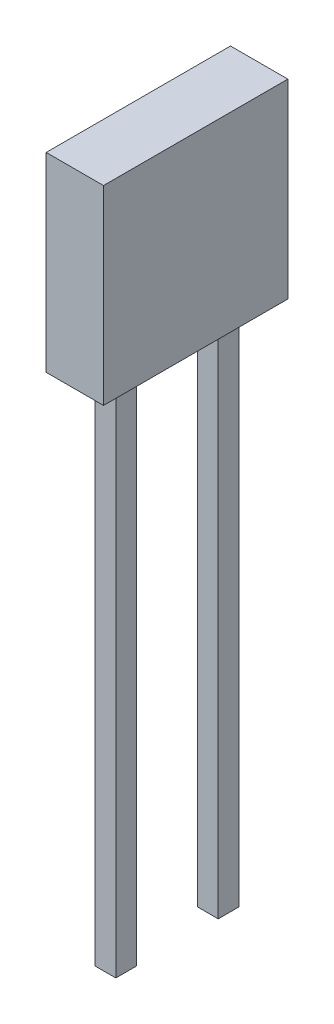
ISO-10303-21;
HEADER;
FILE_DESCRIPTION(('STEP AP214'),'2;1');
FILE_NAME('part.step','',(''),(''),'','','');
FILE_SCHEMA(('AUTOMOTIVE_DESIGN { 1 0 10303 214 1 1 1 1 }'));
ENDSEC;
DATA;
#1=APPLICATION_CONTEXT('core data for automotive mechanical design processes');
#2=APPLICATION_PROTOCOL_DEFINITION('international standard','automotive_design',2000,#1);
#3=PRODUCT_CONTEXT('',#1,'mechanical');
#4=PRODUCT('Part','Part','',(#3));
#5=PRODUCT_RELATED_PRODUCT_CATEGORY('part','',(#4));
#6=PRODUCT_DEFINITION_FORMATION('','',#4);
#7=PRODUCT_DEFINITION_CONTEXT('part definition',#1,'design');
#8=PRODUCT_DEFINITION('design','',#6,#7);
#9=PRODUCT_DEFINITION_SHAPE('','',#8);
#10=(LENGTH_UNIT() NAMED_UNIT(*) SI_UNIT(.MILLI.,.METRE.));
#11=(NAMED_UNIT(*) PLANE_ANGLE_UNIT() SI_UNIT($,.RADIAN.));
#12=(NAMED_UNIT(*) SI_UNIT($,.STERADIAN.) SOLID_ANGLE_UNIT());
#13=UNCERTAINTY_MEASURE_WITH_UNIT(LENGTH_MEASURE(1.E-05),#10,'distance_accuracy_value','');
#14=(GEOMETRIC_REPRESENTATION_CONTEXT(3) GLOBAL_UNCERTAINTY_ASSIGNED_CONTEXT((#13)) GLOBAL_UNIT_ASSIGNED_CONTEXT((#10,
#11,#12)) REPRESENTATION_CONTEXT('',''));
#15=CARTESIAN_POINT('',(0.,0.,0.));
#16=DIRECTION('',(0.,0.,1.));
#17=DIRECTION('',(1.,0.,0.));
#18=AXIS2_PLACEMENT_3D('',#15,#16,#17);
#19=CARTESIAN_POINT('',(0.,0.,0.));
#20=DIRECTION('',(0.,1.,0.));
#21=DIRECTION('',(0.,0.,1.));
#22=AXIS2_PLACEMENT_3D('',#19,#20,#21);
#23=PLANE('',#22);
#24=DIRECTION('',(0.,0.,-1.));
#25=VECTOR('',#24,1.);
#26=CARTESIAN_POINT('',(0.444999999999998,0.,-0.744999999999994));
#27=LINE('',#26,#25);
#28=CARTESIAN_POINT('',(0.444999999999998,0.,-0.744999999999994));
#29=VERTEX_POINT('',#28);
#30=CARTESIAN_POINT('',(0.444999999999998,0.,-1.255));
#31=VERTEX_POINT('',#30);
#32=EDGE_CURVE('E145',#29,#31,#27,.T.);
#33=ORIENTED_EDGE('',*,*,#32,.F.);
#34=DIRECTION('',(-1.,0.,0.));
#35=VECTOR('',#34,1.);
#36=CARTESIAN_POINT('',(0.955000000000001,0.,-0.744999999999994));
#37=LINE('',#36,#35);
#38=CARTESIAN_POINT('',(0.955000000000001,0.,-0.744999999999994));
#39=VERTEX_POINT('',#38);
#40=EDGE_CURVE('E158',#39,#29,#37,.T.);
#41=ORIENTED_EDGE('',*,*,#40,.F.);
#42=DIRECTION('',(0.,0.,1.));
#43=VECTOR('',#42,1.);
#44=CARTESIAN_POINT('',(0.955000000000001,0.,-0.744999999999994));
#45=LINE('',#44,#43);
#46=CARTESIAN_POINT('',(0.955000000000001,0.,-1.255));
#47=VERTEX_POINT('',#46);
#48=EDGE_CURVE('E167',#47,#39,#45,.T.);
#49=ORIENTED_EDGE('',*,*,#48,.F.);
#50=DIRECTION('',(1.,0.,0.));
#51=VECTOR('',#50,1.);
#52=CARTESIAN_POINT('',(0.955000000000001,0.,-1.255));
#53=LINE('',#52,#51);
#54=EDGE_CURVE('E148',#31,#47,#53,.T.);
#55=ORIENTED_EDGE('',*,*,#54,.F.);
#56=EDGE_LOOP('',(#33,#41,#49,#55));
#57=FACE_BOUND('',#56,.T.);
#58=DIRECTION('',(0.,0.,1.));
#59=VECTOR('',#58,1.);
#60=CARTESIAN_POINT('',(0.,0.,-4.5));
#61=LINE('',#60,#59);
#62=CARTESIAN_POINT('',(0.,0.,-4.5));
#63=VERTEX_POINT('',#62);
#64=CARTESIAN_POINT('',(0.,0.,0.));
#65=VERTEX_POINT('',#64);
#66=EDGE_CURVE('E183',#63,#65,#61,.T.);
#67=ORIENTED_EDGE('',*,*,#66,.F.);
#68=DIRECTION('',(-1.,0.,0.));
#69=VECTOR('',#68,1.);
#70=CARTESIAN_POINT('',(0.,0.,-4.5));
#71=LINE('',#70,#69);
#72=CARTESIAN_POINT('',(1.4,0.,-4.5));
#73=VERTEX_POINT('',#72);
#74=EDGE_CURVE('E188',#73,#63,#71,.T.);
#75=ORIENTED_EDGE('',*,*,#74,.F.);
#76=DIRECTION('',(0.,0.,-1.));
#77=VECTOR('',#76,1.);
#78=CARTESIAN_POINT('',(1.4,0.,-4.5));
#79=LINE('',#78,#77);
#80=CARTESIAN_POINT('',(1.4,0.,0.));
#81=VERTEX_POINT('',#80);
#82=EDGE_CURVE('E199',#81,#73,#79,.T.);
#83=ORIENTED_EDGE('',*,*,#82,.F.);
#84=DIRECTION('',(1.,0.,0.));
#85=VECTOR('',#84,1.);
#86=CARTESIAN_POINT('',(0.,0.,0.));
#87=LINE('',#86,#85);
#88=EDGE_CURVE('E197',#65,#81,#87,.T.);
#89=ORIENTED_EDGE('',*,*,#88,.F.);
#90=EDGE_LOOP('',(#67,#75,#83,#89));
#91=FACE_BOUND('',#90,.T.);
#92=DIRECTION('',(0.,0.,-1.));
#93=VECTOR('',#92,1.);
#94=CARTESIAN_POINT('',(0.444999999999998,0.,-3.755));
#95=LINE('',#94,#93);
#96=CARTESIAN_POINT('',(0.444999999999998,0.,-3.245));
#97=VERTEX_POINT('',#96);
#98=CARTESIAN_POINT('',(0.444999999999998,0.,-3.755));
#99=VERTEX_POINT('',#98);
#100=EDGE_CURVE('E144',#97,#99,#95,.T.);
#101=ORIENTED_EDGE('',*,*,#100,.F.);
#102=DIRECTION('',(-1.,0.,0.));
#103=VECTOR('',#102,1.);
#104=CARTESIAN_POINT('',(0.955000000000001,0.,-3.245));
#105=LINE('',#104,#103);
#106=CARTESIAN_POINT('',(0.955000000000001,0.,-3.245));
#107=VERTEX_POINT('',#106);
#108=EDGE_CURVE('E141',#107,#97,#105,.T.);
#109=ORIENTED_EDGE('',*,*,#108,.F.);
#110=DIRECTION('',(0.,0.,1.));
#111=VECTOR('',#110,1.);
#112=CARTESIAN_POINT('',(0.955000000000001,0.,-3.755));
#113=LINE('',#112,#111);
#114=CARTESIAN_POINT('',(0.955000000000001,0.,-3.755));
#115=VERTEX_POINT('',#114);
#116=EDGE_CURVE('E55',#115,#107,#113,.T.);
#117=ORIENTED_EDGE('',*,*,#116,.F.);
#118=DIRECTION('',(1.,0.,0.));
#119=VECTOR('',#118,1.);
#120=CARTESIAN_POINT('',(0.955000000000001,0.,-3.755));
#121=LINE('',#120,#119);
#122=EDGE_CURVE('E50',#99,#115,#121,.T.);
#123=ORIENTED_EDGE('',*,*,#122,.F.);
#124=EDGE_LOOP('',(#101,#109,#117,#123));
#125=FACE_BOUND('',#124,.T.);
#126=ADVANCED_FACE('F35',(#57,#91,#125),#23,.F.);
#127=CARTESIAN_POINT('',(0.,4.65,-4.5));
#128=DIRECTION('',(1.,0.,0.));
#129=DIRECTION('',(0.,0.,-1.));
#130=AXIS2_PLACEMENT_3D('',#127,#128,#129);
#131=PLANE('',#130);
#132=ORIENTED_EDGE('',*,*,#66,.T.);
#133=DIRECTION('',(0.,-1.,0.));
#134=VECTOR('',#133,1.);
#135=CARTESIAN_POINT('',(0.,4.65,0.));
#136=LINE('',#135,#134);
#137=CARTESIAN_POINT('',(0.,4.65,0.));
#138=VERTEX_POINT('',#137);
#139=EDGE_CURVE('E11',#138,#65,#136,.T.);
#140=ORIENTED_EDGE('',*,*,#139,.F.);
#141=DIRECTION('',(0.,0.,1.));
#142=VECTOR('',#141,1.);
#143=CARTESIAN_POINT('',(0.,4.65,-4.5));
#144=LINE('',#143,#142);
#145=CARTESIAN_POINT('',(0.,4.65,-4.5));
#146=VERTEX_POINT('',#145);
#147=EDGE_CURVE('E184',#146,#138,#144,.T.);
#148=ORIENTED_EDGE('',*,*,#147,.F.);
#149=DIRECTION('',(0.,-1.,0.));
#150=VECTOR('',#149,1.);
#151=CARTESIAN_POINT('',(0.,4.65,-4.5));
#152=LINE('',#151,#150);
#153=EDGE_CURVE('E194',#146,#63,#152,.T.);
#154=ORIENTED_EDGE('',*,*,#153,.T.);
#155=EDGE_LOOP('',(#132,#140,#148,#154));
#156=FACE_BOUND('',#155,.T.);
#157=ADVANCED_FACE('F37',(#156),#131,.F.);
#158=CARTESIAN_POINT('',(0.,4.65,0.));
#159=DIRECTION('',(0.,0.,-1.));
#160=DIRECTION('',(-1.,0.,0.));
#161=AXIS2_PLACEMENT_3D('',#158,#159,#160);
#162=PLANE('',#161);
#163=ORIENTED_EDGE('',*,*,#88,.T.);
#164=DIRECTION('',(0.,-1.,0.));
#165=VECTOR('',#164,1.);
#166=CARTESIAN_POINT('',(1.4,4.65,0.));
#167=LINE('',#166,#165);
#168=CARTESIAN_POINT('',(1.4,4.65,0.));
#169=VERTEX_POINT('',#168);
#170=EDGE_CURVE('E43',#169,#81,#167,.T.);
#171=ORIENTED_EDGE('',*,*,#170,.F.);
#172=DIRECTION('',(1.,0.,0.));
#173=VECTOR('',#172,1.);
#174=CARTESIAN_POINT('',(0.,4.65,0.));
#175=LINE('',#174,#173);
#176=EDGE_CURVE('E187',#138,#169,#175,.T.);
#177=ORIENTED_EDGE('',*,*,#176,.F.);
#178=ORIENTED_EDGE('',*,*,#139,.T.);
#179=EDGE_LOOP('',(#163,#171,#177,#178));
#180=FACE_BOUND('',#179,.T.);
#181=ADVANCED_FACE('F226',(#180),#162,.F.);
#182=CARTESIAN_POINT('',(1.4,4.65,-4.5));
#183=DIRECTION('',(-1.,0.,0.));
#184=DIRECTION('',(0.,0.,1.));
#185=AXIS2_PLACEMENT_3D('',#182,#183,#184);
#186=PLANE('',#185);
#187=ORIENTED_EDGE('',*,*,#82,.T.);
#188=DIRECTION('',(0.,-1.,0.));
#189=VECTOR('',#188,1.);
#190=CARTESIAN_POINT('',(1.4,4.65,-4.5));
#191=LINE('',#190,#189);
#192=CARTESIAN_POINT('',(1.4,4.65,-4.5));
#193=VERTEX_POINT('',#192);
#194=EDGE_CURVE('E204',#193,#73,#191,.T.);
#195=ORIENTED_EDGE('',*,*,#194,.F.);
#196=DIRECTION('',(0.,0.,-1.));
#197=VECTOR('',#196,1.);
#198=CARTESIAN_POINT('',(1.4,4.65,-4.5));
#199=LINE('',#198,#197);
#200=EDGE_CURVE('E190',#169,#193,#199,.T.);
#201=ORIENTED_EDGE('',*,*,#200,.F.);
#202=ORIENTED_EDGE('',*,*,#170,.T.);
#203=EDGE_LOOP('',(#187,#195,#201,#202));
#204=FACE_BOUND('',#203,.T.);
#205=ADVANCED_FACE('F211',(#204),#186,.F.);
#206=CARTESIAN_POINT('',(0.,4.65,-4.5));
#207=DIRECTION('',(0.,0.,1.));
#208=DIRECTION('',(1.,0.,0.));
#209=AXIS2_PLACEMENT_3D('',#206,#207,#208);
#210=PLANE('',#209);
#211=ORIENTED_EDGE('',*,*,#74,.T.);
#212=ORIENTED_EDGE('',*,*,#153,.F.);
#213=DIRECTION('',(-1.,0.,0.));
#214=VECTOR('',#213,1.);
#215=CARTESIAN_POINT('',(0.,4.65,-4.5));
#216=LINE('',#215,#214);
#217=EDGE_CURVE('E192',#193,#146,#216,.T.);
#218=ORIENTED_EDGE('',*,*,#217,.F.);
#219=ORIENTED_EDGE('',*,*,#194,.T.);
#220=EDGE_LOOP('',(#211,#212,#218,#219));
#221=FACE_BOUND('',#220,.T.);
#222=ADVANCED_FACE('F219',(#221),#210,.F.);
#223=CARTESIAN_POINT('',(0.,4.65,0.));
#224=DIRECTION('',(0.,1.,0.));
#225=DIRECTION('',(0.,0.,1.));
#226=AXIS2_PLACEMENT_3D('',#223,#224,#225);
#227=PLANE('',#226);
#228=ORIENTED_EDGE('',*,*,#147,.T.);
#229=ORIENTED_EDGE('',*,*,#176,.T.);
#230=ORIENTED_EDGE('',*,*,#200,.T.);
#231=ORIENTED_EDGE('',*,*,#217,.T.);
#232=EDGE_LOOP('',(#228,#229,#230,#231));
#233=FACE_BOUND('',#232,.T.);
#234=ADVANCED_FACE('F225',(#233),#227,.T.);
#235=CARTESIAN_POINT('',(0.444999999999998,-12.7,-0.744999999999994));
#236=DIRECTION('',(1.,0.,0.));
#237=DIRECTION('',(0.,0.,-1.));
#238=AXIS2_PLACEMENT_3D('',#235,#236,#237);
#239=PLANE('',#238);
#240=ORIENTED_EDGE('',*,*,#32,.T.);
#241=DIRECTION('',(0.,1.,0.));
#242=VECTOR('',#241,1.);
#243=CARTESIAN_POINT('',(0.444999999999998,-12.7,-1.255));
#244=LINE('',#243,#242);
#245=CARTESIAN_POINT('',(0.444999999999998,-12.7,-1.255));
#246=VERTEX_POINT('',#245);
#247=EDGE_CURVE('E180',#246,#31,#244,.T.);
#248=ORIENTED_EDGE('',*,*,#247,.F.);
#249=DIRECTION('',(0.,0.,-1.));
#250=VECTOR('',#249,1.);
#251=CARTESIAN_POINT('',(0.444999999999998,-12.7,-0.744999999999994));
#252=LINE('',#251,#250);
#253=CARTESIAN_POINT('',(0.444999999999998,-12.7,-0.744999999999994));
#254=VERTEX_POINT('',#253);
#255=EDGE_CURVE('E154',#254,#246,#252,.T.);
#256=ORIENTED_EDGE('',*,*,#255,.F.);
#257=DIRECTION('',(0.,1.,0.));
#258=VECTOR('',#257,1.);
#259=CARTESIAN_POINT('',(0.444999999999998,-12.7,-0.744999999999994));
#260=LINE('',#259,#258);
#261=EDGE_CURVE('E163',#254,#29,#260,.T.);
#262=ORIENTED_EDGE('',*,*,#261,.T.);
#263=EDGE_LOOP('',(#240,#248,#256,#262));
#264=FACE_BOUND('',#263,.T.);
#265=ADVANCED_FACE('F245',(#264),#239,.F.);
#266=CARTESIAN_POINT('',(0.955000000000001,-12.7,-1.255));
#267=DIRECTION('',(0.,0.,1.));
#268=DIRECTION('',(1.,0.,0.));
#269=AXIS2_PLACEMENT_3D('',#266,#267,#268);
#270=PLANE('',#269);
#271=ORIENTED_EDGE('',*,*,#54,.T.);
#272=DIRECTION('',(0.,1.,0.));
#273=VECTOR('',#272,1.);
#274=CARTESIAN_POINT('',(0.955000000000001,-12.7,-1.255));
#275=LINE('',#274,#273);
#276=CARTESIAN_POINT('',(0.955000000000001,-12.7,-1.255));
#277=VERTEX_POINT('',#276);
#278=EDGE_CURVE('E177',#277,#47,#275,.T.);
#279=ORIENTED_EDGE('',*,*,#278,.F.);
#280=DIRECTION('',(1.,0.,0.));
#281=VECTOR('',#280,1.);
#282=CARTESIAN_POINT('',(0.955000000000001,-12.7,-1.255));
#283=LINE('',#282,#281);
#284=EDGE_CURVE('E157',#246,#277,#283,.T.);
#285=ORIENTED_EDGE('',*,*,#284,.F.);
#286=ORIENTED_EDGE('',*,*,#247,.T.);
#287=EDGE_LOOP('',(#271,#279,#285,#286));
#288=FACE_BOUND('',#287,.T.);
#289=ADVANCED_FACE('F249',(#288),#270,.F.);
#290=CARTESIAN_POINT('',(0.955000000000001,-12.7,-0.744999999999994));
#291=DIRECTION('',(-1.,0.,0.));
#292=DIRECTION('',(0.,0.,1.));
#293=AXIS2_PLACEMENT_3D('',#290,#291,#292);
#294=PLANE('',#293);
#295=ORIENTED_EDGE('',*,*,#48,.T.);
#296=DIRECTION('',(0.,1.,0.));
#297=VECTOR('',#296,1.);
#298=CARTESIAN_POINT('',(0.955000000000001,-12.7,-0.744999999999994));
#299=LINE('',#298,#297);
#300=CARTESIAN_POINT('',(0.955000000000001,-12.7,-0.744999999999994));
#301=VERTEX_POINT('',#300);
#302=EDGE_CURVE('E174',#301,#39,#299,.T.);
#303=ORIENTED_EDGE('',*,*,#302,.F.);
#304=DIRECTION('',(0.,0.,1.));
#305=VECTOR('',#304,1.);
#306=CARTESIAN_POINT('',(0.955000000000001,-12.7,-0.744999999999994));
#307=LINE('',#306,#305);
#308=EDGE_CURVE('E160',#277,#301,#307,.T.);
#309=ORIENTED_EDGE('',*,*,#308,.F.);
#310=ORIENTED_EDGE('',*,*,#278,.T.);
#311=EDGE_LOOP('',(#295,#303,#309,#310));
#312=FACE_BOUND('',#311,.T.);
#313=ADVANCED_FACE('F254',(#312),#294,.F.);
#314=CARTESIAN_POINT('',(0.955000000000001,-12.7,-0.744999999999994));
#315=DIRECTION('',(0.,0.,-1.));
#316=DIRECTION('',(-1.,0.,0.));
#317=AXIS2_PLACEMENT_3D('',#314,#315,#316);
#318=PLANE('',#317);
#319=ORIENTED_EDGE('',*,*,#40,.T.);
#320=ORIENTED_EDGE('',*,*,#261,.F.);
#321=DIRECTION('',(-1.,0.,0.));
#322=VECTOR('',#321,1.);
#323=CARTESIAN_POINT('',(0.955000000000001,-12.7,-0.744999999999994));
#324=LINE('',#323,#322);
#325=EDGE_CURVE('E162',#301,#254,#324,.T.);
#326=ORIENTED_EDGE('',*,*,#325,.F.);
#327=ORIENTED_EDGE('',*,*,#302,.T.);
#328=EDGE_LOOP('',(#319,#320,#326,#327));
#329=FACE_BOUND('',#328,.T.);
#330=ADVANCED_FACE('F260',(#329),#318,.F.);
#331=CARTESIAN_POINT('',(0.444999999999998,-12.7,-1.255));
#332=DIRECTION('',(0.,1.,0.));
#333=DIRECTION('',(0.,0.,1.));
#334=AXIS2_PLACEMENT_3D('',#331,#332,#333);
#335=PLANE('',#334);
#336=ORIENTED_EDGE('',*,*,#255,.T.);
#337=ORIENTED_EDGE('',*,*,#284,.T.);
#338=ORIENTED_EDGE('',*,*,#308,.T.);
#339=ORIENTED_EDGE('',*,*,#325,.T.);
#340=EDGE_LOOP('',(#336,#337,#338,#339));
#341=FACE_BOUND('',#340,.T.);
#342=ADVANCED_FACE('F264',(#341),#335,.F.);
#343=CARTESIAN_POINT('',(0.444999999999998,-12.7,-3.755));
#344=DIRECTION('',(1.,0.,0.));
#345=DIRECTION('',(0.,0.,-1.));
#346=AXIS2_PLACEMENT_3D('',#343,#344,#345);
#347=PLANE('',#346);
#348=ORIENTED_EDGE('',*,*,#100,.T.);
#349=DIRECTION('',(0.,1.,0.));
#350=VECTOR('',#349,1.);
#351=CARTESIAN_POINT('',(0.444999999999998,-12.7,-3.755));
#352=LINE('',#351,#350);
#353=CARTESIAN_POINT('',(0.444999999999998,-12.7,-3.755));
#354=VERTEX_POINT('',#353);
#355=EDGE_CURVE('E125',#354,#99,#352,.T.);
#356=ORIENTED_EDGE('',*,*,#355,.F.);
#357=DIRECTION('',(0.,0.,-1.));
#358=VECTOR('',#357,1.);
#359=CARTESIAN_POINT('',(0.444999999999998,-12.7,-3.755));
#360=LINE('',#359,#358);
#361=CARTESIAN_POINT('',(0.444999999999998,-12.7,-3.245));
#362=VERTEX_POINT('',#361);
#363=EDGE_CURVE('E132',#362,#354,#360,.T.);
#364=ORIENTED_EDGE('',*,*,#363,.F.);
#365=DIRECTION('',(0.,1.,0.));
#366=VECTOR('',#365,1.);
#367=CARTESIAN_POINT('',(0.444999999999998,-12.7,-3.245));
#368=LINE('',#367,#366);
#369=EDGE_CURVE('E370',#362,#97,#368,.T.);
#370=ORIENTED_EDGE('',*,*,#369,.T.);
#371=EDGE_LOOP('',(#348,#356,#364,#370));
#372=FACE_BOUND('',#371,.T.);
#373=ADVANCED_FACE('F143',(#372),#347,.F.);
#374=CARTESIAN_POINT('',(0.955000000000001,-12.7,-3.755));
#375=DIRECTION('',(0.,0.,1.));
#376=DIRECTION('',(1.,0.,0.));
#377=AXIS2_PLACEMENT_3D('',#374,#375,#376);
#378=PLANE('',#377);
#379=ORIENTED_EDGE('',*,*,#122,.T.);
#380=DIRECTION('',(0.,1.,0.));
#381=VECTOR('',#380,1.);
#382=CARTESIAN_POINT('',(0.955000000000001,-12.7,-3.755));
#383=LINE('',#382,#381);
#384=CARTESIAN_POINT('',(0.955000000000001,-12.7,-3.755));
#385=VERTEX_POINT('',#384);
#386=EDGE_CURVE('E128',#385,#115,#383,.T.);
#387=ORIENTED_EDGE('',*,*,#386,.F.);
#388=DIRECTION('',(1.,0.,0.));
#389=VECTOR('',#388,1.);
#390=CARTESIAN_POINT('',(0.955000000000001,-12.7,-3.755));
#391=LINE('',#390,#389);
#392=EDGE_CURVE('E121',#354,#385,#391,.T.);
#393=ORIENTED_EDGE('',*,*,#392,.F.);
#394=ORIENTED_EDGE('',*,*,#355,.T.);
#395=EDGE_LOOP('',(#379,#387,#393,#394));
#396=FACE_BOUND('',#395,.T.);
#397=ADVANCED_FACE('F123',(#396),#378,.F.);
#398=CARTESIAN_POINT('',(0.955000000000001,-12.7,-3.755));
#399=DIRECTION('',(-1.,0.,0.));
#400=DIRECTION('',(0.,0.,1.));
#401=AXIS2_PLACEMENT_3D('',#398,#399,#400);
#402=PLANE('',#401);
#403=ORIENTED_EDGE('',*,*,#116,.T.);
#404=DIRECTION('',(0.,1.,0.));
#405=VECTOR('',#404,1.);
#406=CARTESIAN_POINT('',(0.955000000000001,-12.7,-3.245));
#407=LINE('',#406,#405);
#408=CARTESIAN_POINT('',(0.955000000000001,-12.7,-3.245));
#409=VERTEX_POINT('',#408);
#410=EDGE_CURVE('E150',#409,#107,#407,.T.);
#411=ORIENTED_EDGE('',*,*,#410,.F.);
#412=DIRECTION('',(0.,0.,1.));
#413=VECTOR('',#412,1.);
#414=CARTESIAN_POINT('',(0.955000000000001,-12.7,-3.755));
#415=LINE('',#414,#413);
#416=EDGE_CURVE('E131',#385,#409,#415,.T.);
#417=ORIENTED_EDGE('',*,*,#416,.F.);
#418=ORIENTED_EDGE('',*,*,#386,.T.);
#419=EDGE_LOOP('',(#403,#411,#417,#418));
#420=FACE_BOUND('',#419,.T.);
#421=ADVANCED_FACE('F273',(#420),#402,.F.);
#422=CARTESIAN_POINT('',(0.955000000000001,-12.7,-3.245));
#423=DIRECTION('',(0.,0.,-1.));
#424=DIRECTION('',(-1.,0.,0.));
#425=AXIS2_PLACEMENT_3D('',#422,#423,#424);
#426=PLANE('',#425);
#427=ORIENTED_EDGE('',*,*,#108,.T.);
#428=ORIENTED_EDGE('',*,*,#369,.F.);
#429=DIRECTION('',(-1.,0.,0.));
#430=VECTOR('',#429,1.);
#431=CARTESIAN_POINT('',(0.955000000000001,-12.7,-3.245));
#432=LINE('',#431,#430);
#433=EDGE_CURVE('E137',#409,#362,#432,.T.);
#434=ORIENTED_EDGE('',*,*,#433,.F.);
#435=ORIENTED_EDGE('',*,*,#410,.T.);
#436=EDGE_LOOP('',(#427,#428,#434,#435));
#437=FACE_BOUND('',#436,.T.);
#438=ADVANCED_FACE('F276',(#437),#426,.F.);
#439=CARTESIAN_POINT('',(0.444999999999998,-12.7,-3.245));
#440=DIRECTION('',(0.,-1.,0.));
#441=DIRECTION('',(0.,0.,-1.));
#442=AXIS2_PLACEMENT_3D('',#439,#440,#441);
#443=PLANE('',#442);
#444=ORIENTED_EDGE('',*,*,#363,.T.);
#445=ORIENTED_EDGE('',*,*,#392,.T.);
#446=ORIENTED_EDGE('',*,*,#416,.T.);
#447=ORIENTED_EDGE('',*,*,#433,.T.);
#448=EDGE_LOOP('',(#444,#445,#446,#447));
#449=FACE_BOUND('',#448,.T.);
#450=ADVANCED_FACE('F135',(#449),#443,.T.);
#451=CLOSED_SHELL('',(#126,#157,#181,#205,#222,#234,#265,#289,#313,#330,#342,#373,#397,#421,
#438,#450));
#452=MANIFOLD_SOLID_BREP('B2',#451);
#453=ADVANCED_BREP_SHAPE_REPRESENTATION('',(#18,#452),#14);
#454=SHAPE_DEFINITION_REPRESENTATION(#9,#453);
ENDSEC;
END-ISO-10303-21;
